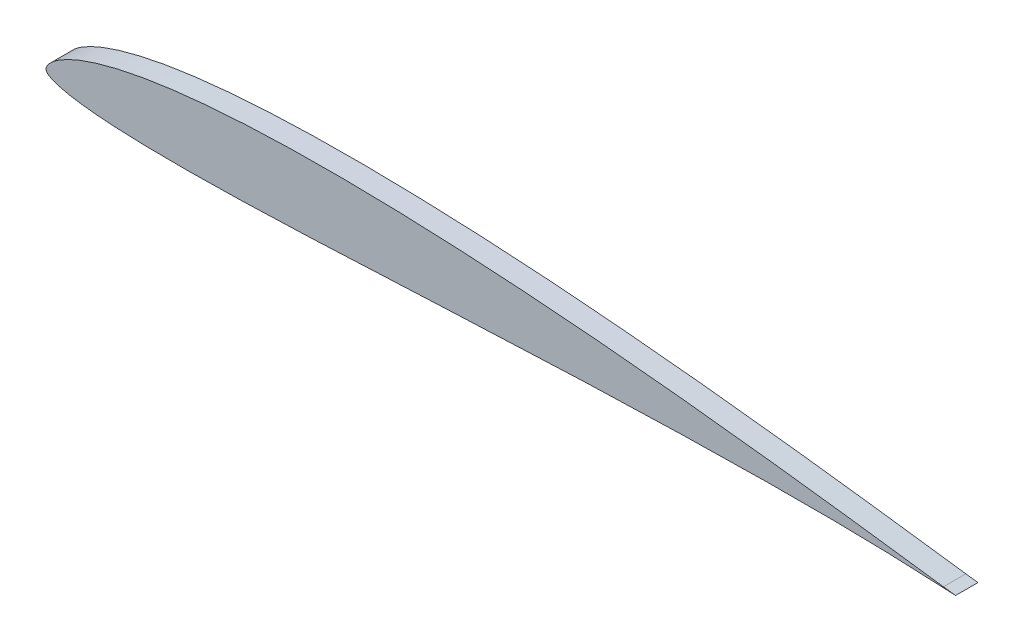
ISO-10303-21;
HEADER;
FILE_DESCRIPTION(('STEP AP214'),'2;1');
FILE_NAME('part.step','',(''),(''),'','','');
FILE_SCHEMA(('AUTOMOTIVE_DESIGN { 1 0 10303 214 1 1 1 1 }'));
ENDSEC;
DATA;
#1=APPLICATION_CONTEXT('core data for automotive mechanical design processes');
#2=APPLICATION_PROTOCOL_DEFINITION('international standard','automotive_design',2000,#1);
#3=PRODUCT_CONTEXT('',#1,'mechanical');
#4=PRODUCT('Part','Part','',(#3));
#5=PRODUCT_RELATED_PRODUCT_CATEGORY('part','',(#4));
#6=PRODUCT_DEFINITION_FORMATION('','',#4);
#7=PRODUCT_DEFINITION_CONTEXT('part definition',#1,'design');
#8=PRODUCT_DEFINITION('design','',#6,#7);
#9=PRODUCT_DEFINITION_SHAPE('','',#8);
#10=(LENGTH_UNIT() NAMED_UNIT(*) SI_UNIT(.MILLI.,.METRE.));
#11=(NAMED_UNIT(*) PLANE_ANGLE_UNIT() SI_UNIT($,.RADIAN.));
#12=(NAMED_UNIT(*) SI_UNIT($,.STERADIAN.) SOLID_ANGLE_UNIT());
#13=UNCERTAINTY_MEASURE_WITH_UNIT(LENGTH_MEASURE(1.E-05),#10,'distance_accuracy_value','');
#14=(GEOMETRIC_REPRESENTATION_CONTEXT(3) GLOBAL_UNCERTAINTY_ASSIGNED_CONTEXT((#13)) GLOBAL_UNIT_ASSIGNED_CONTEXT((#10,
#11,#12)) REPRESENTATION_CONTEXT('',''));
#15=CARTESIAN_POINT('',(0.,0.,0.));
#16=DIRECTION('',(0.,0.,1.));
#17=DIRECTION('',(1.,0.,0.));
#18=AXIS2_PLACEMENT_3D('',#15,#16,#17);
#19=CARTESIAN_POINT('',(203.2,-0.100617268431985,5.08));
#20=DIRECTION('',(0.121749636772563,0.992560842440275,0.));
#21=DIRECTION('',(-0.992560842440275,0.121749636772563,0.));
#22=AXIS2_PLACEMENT_3D('',#19,#20,#21);
#23=PLANE('',#22);
#24=DIRECTION('',(0.992560842440275,-0.121749636772563,0.));
#25=VECTOR('',#24,1.);
#26=CARTESIAN_POINT('',(203.2,-0.100617268431985,0.));
#27=LINE('',#26,#25);
#28=CARTESIAN_POINT('',(203.2,-0.100617268431985,0.));
#29=VERTEX_POINT('',#28);
#30=CARTESIAN_POINT('',(205.950245435933,-0.437968258459964,0.));
#31=VERTEX_POINT('',#30);
#32=EDGE_CURVE('E110',#29,#31,#27,.T.);
#33=ORIENTED_EDGE('',*,*,#32,.F.);
#34=DIRECTION('',(0.,0.,-1.));
#35=VECTOR('',#34,1.);
#36=CARTESIAN_POINT('',(203.2,-0.100617268431985,5.08));
#37=LINE('',#36,#35);
#38=CARTESIAN_POINT('',(203.2,-0.100617268431985,5.08));
#39=VERTEX_POINT('',#38);
#40=EDGE_CURVE('E12',#39,#29,#37,.T.);
#41=ORIENTED_EDGE('',*,*,#40,.F.);
#42=DIRECTION('',(0.992560842440275,-0.121749636772563,0.));
#43=VECTOR('',#42,1.);
#44=CARTESIAN_POINT('',(203.2,-0.100617268431985,5.08));
#45=LINE('',#44,#43);
#46=CARTESIAN_POINT('',(205.950245435933,-0.437968258459964,5.08));
#47=VERTEX_POINT('',#46);
#48=EDGE_CURVE('E97',#39,#47,#45,.T.);
#49=ORIENTED_EDGE('',*,*,#48,.T.);
#50=DIRECTION('',(0.,0.,-1.));
#51=VECTOR('',#50,1.);
#52=CARTESIAN_POINT('',(205.950245435933,-0.437968258459964,5.08));
#53=LINE('',#52,#51);
#54=EDGE_CURVE('E53',#47,#31,#53,.T.);
#55=ORIENTED_EDGE('',*,*,#54,.T.);
#56=EDGE_LOOP('',(#33,#41,#49,#55));
#57=FACE_BOUND('',#56,.T.);
#58=ADVANCED_FACE('F50',(#57),#23,.T.);
#59=CARTESIAN_POINT('',(203.2,-0.100617268431985,5.08));
#60=CARTESIAN_POINT('',(202.79720381662,-0.0512094266927017,5.08));
#61=CARTESIAN_POINT('',(201.580451916311,0.0980399649523381,5.08));
#62=CARTESIAN_POINT('',(199.447976907084,0.38451258538858,5.08));
#63=CARTESIAN_POINT('',(196.77975352602,0.739681963357594,5.08));
#64=CARTESIAN_POINT('',(193.985109848868,1.11895027312733,5.08));
#65=CARTESIAN_POINT('',(191.167417319945,1.49849757920047,5.08));
#66=CARTESIAN_POINT('',(188.346823798527,1.87616372226673,5.08));
#67=CARTESIAN_POINT('',(185.525409830636,2.24832243215014,5.08));
#68=CARTESIAN_POINT('',(182.703701905195,2.61673136002112,5.08));
#69=CARTESIAN_POINT('',(179.881561947793,2.97988541238249,5.08));
#70=CARTESIAN_POINT('',(177.059611950278,3.33878805501201,5.08));
#71=CARTESIAN_POINT('',(174.237524109839,3.69279564658321,5.08));
#72=CARTESIAN_POINT('',(170.475518901404,4.15997719687129,5.08));
#73=CARTESIAN_POINT('',(166.712715756317,4.61814924928133,5.08));
#74=CARTESIAN_POINT('',(162.949590213769,5.06673403109628,5.08));
#75=CARTESIAN_POINT('',(160.127061411144,5.39842344580611,5.08));
#76=CARTESIAN_POINT('',(157.304169872805,5.72410874023895,5.08));
#77=CARTESIAN_POINT('',(154.480835019842,6.04516962667473,5.08));
#78=CARTESIAN_POINT('',(151.656904615995,6.36014932324074,5.08));
#79=CARTESIAN_POINT('',(148.832344040144,6.6691102541897,5.08));
#80=CARTESIAN_POINT('',(146.007360314413,6.97258671041729,5.08));
#81=CARTESIAN_POINT('',(143.182003447861,7.26965220951078,5.08));
#82=CARTESIAN_POINT('',(140.356401756629,7.56054211895568,5.08));
#83=CARTESIAN_POINT('',(137.530435232801,7.84454614479991,5.08));
#84=CARTESIAN_POINT('',(134.704500587303,8.12183903814579,5.08));
#85=CARTESIAN_POINT('',(131.878411459751,8.39157565062392,5.08));
#86=CARTESIAN_POINT('',(129.052105194243,8.65344802495918,5.08));
#87=CARTESIAN_POINT('',(126.225681336403,8.90753779422576,5.08));
#88=CARTESIAN_POINT('',(123.399293267781,9.15314243325294,5.08));
#89=CARTESIAN_POINT('',(120.572870301902,9.39080691789401,5.08));
#90=CARTESIAN_POINT('',(116.804935383238,9.69600830861639,5.08));
#91=CARTESIAN_POINT('',(113.036553757512,9.98407047718813,5.08));
#92=CARTESIAN_POINT('',(109.267987351327,10.2536282535774,5.08));
#93=CARTESIAN_POINT('',(105.50092830803,10.5108698643073,5.08));
#94=CARTESIAN_POINT('',(101.73364578017,10.7479741965849,5.08));
#95=CARTESIAN_POINT('',(97.9665678603221,10.9655134985737,5.08));
#96=CARTESIAN_POINT('',(95.1421419252916,11.1176231220489,5.08));
#97=CARTESIAN_POINT('',(92.3183449944886,11.25922410986,5.08));
#98=CARTESIAN_POINT('',(89.4952129673963,11.389445435119,5.08));
#99=CARTESIAN_POINT('',(86.6727666862329,11.5082744209002,5.08));
#100=CARTESIAN_POINT('',(82.911487124979,11.6502242618459,5.08));
#101=CARTESIAN_POINT('',(78.2125634469429,11.7968808324985,5.08));
#102=CARTESIAN_POINT('',(73.5147067893036,11.8981108766664,5.08));
#103=CARTESIAN_POINT('',(69.7595282377999,11.9502790282577,5.08));
#104=CARTESIAN_POINT('',(66.9458517726665,11.9731637359591,5.08));
#105=CARTESIAN_POINT('',(64.1341344568586,11.9803154483272,5.08));
#106=CARTESIAN_POINT('',(61.3247831029279,11.969099991853,5.08));
#107=CARTESIAN_POINT('',(58.5181203928593,11.9410404923588,5.08));
#108=CARTESIAN_POINT('',(55.7143676434784,11.8926418307605,5.08));
#109=CARTESIAN_POINT('',(52.9139103469552,11.8241257532925,5.08));
#110=CARTESIAN_POINT('',(49.1872079763454,11.7033830445865,5.08));
#111=CARTESIAN_POINT('',(45.4677328358925,11.5360884720753,5.08));
#112=CARTESIAN_POINT('',(41.7570394075228,11.315286824748,5.08));
#113=CARTESIAN_POINT('',(38.9834482911353,11.1213393320245,5.08));
#114=CARTESIAN_POINT('',(36.218778961995,10.8961714179921,5.08));
#115=CARTESIAN_POINT('',(33.4643126195192,10.6383636978604,5.08));
#116=CARTESIAN_POINT('',(30.7227013236439,10.3430124575744,5.08));
#117=CARTESIAN_POINT('',(27.9961130453882,10.0095671145272,5.08));
#118=CARTESIAN_POINT('',(25.2877944049303,9.63219084756092,5.08));
#119=CARTESIAN_POINT('',(22.6025219853498,9.20739084675282,5.08));
#120=CARTESIAN_POINT('',(19.94483386804,8.72997632176014,5.08));
#121=CARTESIAN_POINT('',(17.3237406783105,8.19362692023427,5.08));
#122=CARTESIAN_POINT('',(14.7477752434259,7.59200620912939,5.08));
#123=CARTESIAN_POINT('',(12.2328314751348,6.91805026154764,5.08));
#124=CARTESIAN_POINT('',(9.80222557833202,6.16435151299876,5.08));
#125=CARTESIAN_POINT('',(7.5013093000574,5.33006385041904,5.08));
#126=CARTESIAN_POINT('',(5.41517133141638,4.43063906254846,5.08));
#127=CARTESIAN_POINT('',(3.66455855511836,3.51646707011307,5.08));
#128=CARTESIAN_POINT('',(2.33735513027934,2.66481601115,5.08));
#129=CARTESIAN_POINT('',(1.42509623429453,1.93915994002003,5.08));
#130=CARTESIAN_POINT('',(0.827981050452847,1.35542237765438,5.08));
#131=CARTESIAN_POINT('',(0.441274327893939,0.880143342873901,5.08));
#132=CARTESIAN_POINT('',(0.19079349595964,0.48090792978633,5.08));
#133=CARTESIAN_POINT('',(0.0404889301550585,0.131446638754077,5.08));
#134=CARTESIAN_POINT('',(-0.0140285352096761,-0.198072904687709,5.08));
#135=CARTESIAN_POINT('',(0.0557841610055205,-0.52264674411364,5.08));
#136=CARTESIAN_POINT('',(0.267897199811082,-0.825744248183187,5.08));
#137=CARTESIAN_POINT('',(0.614779540851643,-1.10917598584658,5.08));
#138=CARTESIAN_POINT('',(1.11880231935604,-1.40291417774954,5.08));
#139=CARTESIAN_POINT('',(1.8617979874032,-1.72658419889645,5.08));
#140=CARTESIAN_POINT('',(2.97005159285745,-2.09381812805213,5.08));
#141=CARTESIAN_POINT('',(4.54337389070912,-2.48316923193071,5.08));
#142=CARTESIAN_POINT('',(6.56825222861549,-2.85713013148444,5.08));
#143=CARTESIAN_POINT('',(8.92223028313623,-3.1759790611986,5.08));
#144=CARTESIAN_POINT('',(11.4590923531043,-3.43624640908878,5.08));
#145=CARTESIAN_POINT('',(14.0888477513325,-3.63824385792425,5.08));
#146=CARTESIAN_POINT('',(16.7692515001657,-3.79053384814901,5.08));
#147=CARTESIAN_POINT('',(19.4819886386148,-3.90267995838003,5.08));
#148=CARTESIAN_POINT('',(22.2173248165483,-3.98108167099376,5.08));
#149=CARTESIAN_POINT('',(24.9688695232444,-4.03216683084729,5.08));
#150=CARTESIAN_POINT('',(27.733036207471,-4.05850158243161,5.08));
#151=CARTESIAN_POINT('',(30.5067787455716,-4.06389493618947,5.08));
#152=CARTESIAN_POINT('',(33.2885628680928,-4.05114134413537,5.08));
#153=CARTESIAN_POINT('',(36.0766256871765,-4.0210375418487,5.08));
#154=CARTESIAN_POINT('',(38.8700221898337,-3.97616253824433,5.08));
#155=CARTESIAN_POINT('',(41.6677542855026,-3.91874383892961,5.08));
#156=CARTESIAN_POINT('',(44.4693361789958,-3.84942363611167,5.08));
#157=CARTESIAN_POINT('',(47.2741644061469,-3.76961386296504,5.08));
#158=CARTESIAN_POINT('',(50.0820296777703,-3.68031157345442,5.08));
#159=CARTESIAN_POINT('',(52.8925506840059,-3.5832183051563,5.08));
#160=CARTESIAN_POINT('',(55.7058179995031,-3.47820123590557,5.08));
#161=CARTESIAN_POINT('',(58.5217362187417,-3.36746625551428,5.08));
#162=CARTESIAN_POINT('',(61.3403840649227,-3.2521181612854,5.08));
#163=CARTESIAN_POINT('',(64.1616519777605,-3.13181482840604,5.08));
#164=CARTESIAN_POINT('',(66.9855748846382,-3.00785734019767,5.08));
#165=CARTESIAN_POINT('',(69.812118227041,-2.88020209229964,5.08));
#166=CARTESIAN_POINT('',(72.6413969315292,-2.75042984375857,5.08));
#167=CARTESIAN_POINT('',(75.4731584291989,-2.61813219833004,5.08));
#168=CARTESIAN_POINT('',(79.2529960165431,-2.44007567766431,5.08));
#169=CARTESIAN_POINT('',(83.0338042932632,-2.26004958539922,5.08));
#170=CARTESIAN_POINT('',(86.8138654439023,-2.07964592480024,5.08));
#171=CARTESIAN_POINT('',(89.6461959911765,-1.94523234448069,5.08));
#172=CARTESIAN_POINT('',(92.4765265757898,-1.81100712196067,5.08));
#173=CARTESIAN_POINT('',(95.304993022605,-1.67881476977027,5.08));
#174=CARTESIAN_POINT('',(98.1316211466072,-1.54824126738652,5.08));
#175=CARTESIAN_POINT('',(100.956506331875,-1.41996075311568,5.08));
#176=CARTESIAN_POINT('',(103.780336268643,-1.2930326243581,5.08));
#177=CARTESIAN_POINT('',(106.60332189158,-1.16940870375824,5.08));
#178=CARTESIAN_POINT('',(109.42541965539,-1.04846442880387,5.08));
#179=CARTESIAN_POINT('',(112.246433737902,-0.9304319450935,5.08));
#180=CARTESIAN_POINT('',(115.066818041738,-0.815131894215961,5.08));
#181=CARTESIAN_POINT('',(117.886361110804,-0.704261200235161,5.08));
#182=CARTESIAN_POINT('',(120.705124684984,-0.596293965319624,5.08));
#183=CARTESIAN_POINT('',(123.522827525326,-0.492777088233758,5.08));
#184=CARTESIAN_POINT('',(126.339771365018,-0.393065039573002,5.08));
#185=CARTESIAN_POINT('',(130.093763619375,-0.266371516886291,5.08));
#186=CARTESIAN_POINT('',(133.846963358215,-0.148319066941068,5.08));
#187=CARTESIAN_POINT('',(137.59959570311,-0.040354383188542,5.08));
#188=CARTESIAN_POINT('',(140.413697463867,0.0362246680191013,5.08));
#189=CARTESIAN_POINT('',(143.22781575284,0.107363689882669,5.08));
#190=CARTESIAN_POINT('',(146.980533751766,0.196449437297716,5.08));
#191=CARTESIAN_POINT('',(150.733888428254,0.274956546231044,5.08));
#192=CARTESIAN_POINT('',(154.487963163436,0.343763847675414,5.08));
#193=CARTESIAN_POINT('',(157.304049111824,0.388107893920395,5.08));
#194=CARTESIAN_POINT('',(160.120792660306,0.427324225694775,5.08));
#195=CARTESIAN_POINT('',(162.938428455789,0.459012795806288,5.08));
#196=CARTESIAN_POINT('',(165.756944662893,0.483220321093811,5.08));
#197=CARTESIAN_POINT('',(168.576075909088,0.498535298272943,5.08));
#198=CARTESIAN_POINT('',(171.395749827843,0.505727248888174,5.08));
#199=CARTESIAN_POINT('',(174.215970767451,0.501872707438048,5.08));
#200=CARTESIAN_POINT('',(177.036738589688,0.488150248349388,5.08));
#201=CARTESIAN_POINT('',(179.857921635086,0.462760491305361,5.08));
#202=CARTESIAN_POINT('',(182.679519704925,0.424417506826524,5.08));
#203=CARTESIAN_POINT('',(185.501374927109,0.371545664049802,5.08));
#204=CARTESIAN_POINT('',(188.323332205707,0.305598234434296,5.08));
#205=CARTESIAN_POINT('',(191.145402373552,0.22358601869094,5.08));
#206=CARTESIAN_POINT('',(193.965637727377,0.126297599844218,5.08));
#207=CARTESIAN_POINT('',(196.767087138439,0.0145845398118625,5.08));
#208=CARTESIAN_POINT('',(199.441721084474,-0.10433682633005,5.08));
#209=CARTESIAN_POINT('',(201.580203970441,-0.212851992987618,5.08));
#210=CARTESIAN_POINT('',(202.796999817628,-0.275533443295145,5.08));
#211=CARTESIAN_POINT('',(203.2,-0.296293405587617,5.08));
#212=B_SPLINE_CURVE_WITH_KNOTS('',3,(#59,#60,#61,#62,#63,#64,#65,#66,#67,#68,#69,#70,#71,#72,
#73,#74,#75,#76,#77,#78,#79,#80,#81,#82,#83,#84,#85,#86,#87,#88,#89,#90,#91,#92,#93,#94,#95,#96,
#97,#98,#99,#100,#101,#102,#103,#104,#105,#106,#107,#108,#109,#110,#111,#112,#113,#114,#115,
#116,#117,#118,#119,#120,#121,#122,#123,#124,#125,#126,#127,#128,#129,#130,#131,#132,#133,#134,
#135,#136,#137,#138,#139,#140,#141,#142,#143,#144,#145,#146,#147,#148,#149,#150,#151,#152,#153,
#154,#155,#156,#157,#158,#159,#160,#161,#162,#163,#164,#165,#166,#167,#168,#169,#170,#171,#172,
#173,#174,#175,#176,#177,#178,#179,#180,#181,#182,#183,#184,#185,#186,#187,#188,#189,#190,#191,
#192,#193,#194,#195,#196,#197,#198,#199,#200,#201,#202,#203,#204,#205,#206,#207,#208,#209,#210,
#211),.UNSPECIFIED.,.F.,.F.,(4,1,1,1,1,1,1,1,1,1,1,1,1,1,1,1,1,1,1,1,1,1,1,1,1,1,1,1,1,1,1,1,1,
1,1,1,1,1,1,1,1,1,1,1,1,1,1,1,1,1,1,1,1,1,1,1,1,1,1,1,1,1,1,1,1,1,1,1,1,1,1,1,1,1,1,1,1,1,1,1,1,
1,1,1,1,1,1,1,1,1,1,1,1,1,1,1,1,1,1,1,1,1,1,1,1,1,1,1,1,1,1,1,1,1,1,1,1,1,1,1,1,1,1,1,1,1,1,1,1,
1,1,1,1,1,1,1,1,1,1,1,1,1,1,1,1,1,1,1,1,1,4),(0.,0.00296411665271611,0.0089538945966763,
0.0157155553741986,0.022625190175558,0.0295534555378367,0.0364822705336194,0.0434110582244961,
0.0503399655545711,0.0572673467736388,0.0641943281808356,0.0711179201706099,0.0780418206164881,
0.091883617901493,0.098804928653391,0.105722820958378,0.112641625273765,0.119560496658562,
0.126477762921577,0.133395912374017,0.140314536437145,0.14723055601991,0.154146464906324,
0.161062198401924,0.167975777635694,0.174886609289169,0.181798143490229,0.188707924225706,
0.195614440613466,0.202520257363211,0.209425351294229,0.223226072570092,0.230125213713481,
0.237021781364082,0.250805240631273,0.25769625166669,0.264582838722126,0.271465100128855,
0.278347536463628,0.285225271167883,0.29209885669581,0.305839934287044,0.319563209426406,
0.326420187883577,0.333270806703105,0.340115280251541,0.346957312883094,0.353790744437203,
0.360616425322828,0.367439194379685,0.37425161878993,0.387850773907908,0.394633044804391,
0.401402551965937,0.408158543233929,0.414892998053965,0.42160892343845,0.428298863183098,
0.43495597113572,0.441580950447059,0.448155138601882,0.454677179732133,0.461120350253386,
0.467473869945867,0.473690892845259,0.47970221097704,0.485342583587277,0.490271889644776,
0.494111129920548,0.496842211489221,0.498771831369562,0.500198867652721,0.501307654952534,
0.502204472441875,0.502962609813949,0.503708984077282,0.504565750926071,0.505610251628692,
0.506960116907385,0.508815615682967,0.511519486293983,0.51547838259087,0.520644271209619,
0.526552427913912,0.532824473873153,0.539268843888887,0.545815426921883,0.552433143389216,
0.559099351334899,0.565802503912892,0.572533988645433,0.579289903039673,0.586062197427898,
0.592852616441672,0.599655387399752,0.60646812382644,0.613291894201643,0.620124754014497,
0.626963242299182,0.63381128586732,0.640665424121318,0.647526042737776,0.654395046265754,
0.661270455949904,0.668151708455317,0.675041242410986,0.681936976601868,0.688838892603522,
0.695747395053285,0.709576069821284,0.716485747925019,0.723388931395268,0.730287102934606,
0.737182123472742,0.744071007137293,0.750955216594622,0.757836754148853,0.764717490730159,
0.771594467651412,0.778468680155238,0.785340609132731,0.792212161518035,0.799078938597568,
0.805944356214518,0.812806945270248,0.819667180733528,0.833379655024659,0.840234372635546,
0.847088277479736,0.85394185780806,0.860795653863032,0.874506380169985,0.881362851603148,
0.888220537429042,0.895078010559448,0.901938729776825,0.908802231487597,0.915665587920595,
0.922530344940029,0.929397561921198,0.936264857969405,0.943133836181653,0.95000465870612,
0.956876033001204,0.963748611505872,0.97062217782377,0.977497431873452,0.984360164529191,
0.991100560263919,0.997052524591586,1.),.UNSPECIFIED.);
#213=DIRECTION('',(0.,0.,-1.));
#214=VECTOR('',#213,1.);
#215=SURFACE_OF_LINEAR_EXTRUSION('',#212,#214);
#216=CARTESIAN_POINT('',(203.2,-0.100617268431985,0.));
#217=CARTESIAN_POINT('',(202.79720381662,-0.0512094266927017,0.));
#218=CARTESIAN_POINT('',(201.580451916311,0.0980399649523381,0.));
#219=CARTESIAN_POINT('',(199.447976907084,0.38451258538858,0.));
#220=CARTESIAN_POINT('',(196.77975352602,0.739681963357594,0.));
#221=CARTESIAN_POINT('',(193.985109848868,1.11895027312733,0.));
#222=CARTESIAN_POINT('',(191.167417319945,1.49849757920047,0.));
#223=CARTESIAN_POINT('',(188.346823798527,1.87616372226673,0.));
#224=CARTESIAN_POINT('',(185.525409830636,2.24832243215014,0.));
#225=CARTESIAN_POINT('',(182.703701905195,2.61673136002112,0.));
#226=CARTESIAN_POINT('',(179.881561947793,2.97988541238249,0.));
#227=CARTESIAN_POINT('',(177.059611950278,3.33878805501201,0.));
#228=CARTESIAN_POINT('',(174.237524109839,3.69279564658321,0.));
#229=CARTESIAN_POINT('',(170.475518901404,4.15997719687129,0.));
#230=CARTESIAN_POINT('',(166.712715756317,4.61814924928133,0.));
#231=CARTESIAN_POINT('',(162.949590213769,5.06673403109628,0.));
#232=CARTESIAN_POINT('',(160.127061411144,5.39842344580611,0.));
#233=CARTESIAN_POINT('',(157.304169872805,5.72410874023895,0.));
#234=CARTESIAN_POINT('',(154.480835019842,6.04516962667473,0.));
#235=CARTESIAN_POINT('',(151.656904615995,6.36014932324074,0.));
#236=CARTESIAN_POINT('',(148.832344040144,6.6691102541897,0.));
#237=CARTESIAN_POINT('',(146.007360314413,6.97258671041729,0.));
#238=CARTESIAN_POINT('',(143.182003447861,7.26965220951078,0.));
#239=CARTESIAN_POINT('',(140.356401756629,7.56054211895568,0.));
#240=CARTESIAN_POINT('',(137.530435232801,7.84454614479991,0.));
#241=CARTESIAN_POINT('',(134.704500587303,8.12183903814579,0.));
#242=CARTESIAN_POINT('',(131.878411459751,8.39157565062392,0.));
#243=CARTESIAN_POINT('',(129.052105194243,8.65344802495918,0.));
#244=CARTESIAN_POINT('',(126.225681336403,8.90753779422576,0.));
#245=CARTESIAN_POINT('',(123.399293267781,9.15314243325294,0.));
#246=CARTESIAN_POINT('',(120.572870301902,9.39080691789401,0.));
#247=CARTESIAN_POINT('',(116.804935383238,9.69600830861639,0.));
#248=CARTESIAN_POINT('',(113.036553757512,9.98407047718813,0.));
#249=CARTESIAN_POINT('',(109.267987351327,10.2536282535774,0.));
#250=CARTESIAN_POINT('',(105.50092830803,10.5108698643073,0.));
#251=CARTESIAN_POINT('',(101.73364578017,10.7479741965849,0.));
#252=CARTESIAN_POINT('',(97.9665678603221,10.9655134985737,0.));
#253=CARTESIAN_POINT('',(95.1421419252916,11.1176231220489,0.));
#254=CARTESIAN_POINT('',(92.3183449944886,11.25922410986,0.));
#255=CARTESIAN_POINT('',(89.4952129673963,11.389445435119,0.));
#256=CARTESIAN_POINT('',(86.6727666862329,11.5082744209002,0.));
#257=CARTESIAN_POINT('',(82.911487124979,11.6502242618459,0.));
#258=CARTESIAN_POINT('',(78.2125634469429,11.7968808324985,0.));
#259=CARTESIAN_POINT('',(73.5147067893036,11.8981108766664,0.));
#260=CARTESIAN_POINT('',(69.7595282377999,11.9502790282577,0.));
#261=CARTESIAN_POINT('',(66.9458517726665,11.9731637359591,0.));
#262=CARTESIAN_POINT('',(64.1341344568586,11.9803154483272,0.));
#263=CARTESIAN_POINT('',(61.3247831029279,11.969099991853,0.));
#264=CARTESIAN_POINT('',(58.5181203928593,11.9410404923588,0.));
#265=CARTESIAN_POINT('',(55.7143676434784,11.8926418307605,0.));
#266=CARTESIAN_POINT('',(52.9139103469552,11.8241257532925,0.));
#267=CARTESIAN_POINT('',(49.1872079763454,11.7033830445865,0.));
#268=CARTESIAN_POINT('',(45.4677328358925,11.5360884720753,0.));
#269=CARTESIAN_POINT('',(41.7570394075228,11.315286824748,0.));
#270=CARTESIAN_POINT('',(38.9834482911353,11.1213393320245,0.));
#271=CARTESIAN_POINT('',(36.218778961995,10.8961714179921,0.));
#272=CARTESIAN_POINT('',(33.4643126195192,10.6383636978604,0.));
#273=CARTESIAN_POINT('',(30.7227013236439,10.3430124575744,0.));
#274=CARTESIAN_POINT('',(27.9961130453882,10.0095671145272,0.));
#275=CARTESIAN_POINT('',(25.2877944049303,9.63219084756092,0.));
#276=CARTESIAN_POINT('',(22.6025219853498,9.20739084675282,0.));
#277=CARTESIAN_POINT('',(19.94483386804,8.72997632176014,0.));
#278=CARTESIAN_POINT('',(17.3237406783105,8.19362692023427,0.));
#279=CARTESIAN_POINT('',(14.7477752434259,7.59200620912939,0.));
#280=CARTESIAN_POINT('',(12.2328314751348,6.91805026154764,0.));
#281=CARTESIAN_POINT('',(9.80222557833202,6.16435151299876,0.));
#282=CARTESIAN_POINT('',(7.5013093000574,5.33006385041904,0.));
#283=CARTESIAN_POINT('',(5.41517133141638,4.43063906254846,0.));
#284=CARTESIAN_POINT('',(3.66455855511836,3.51646707011307,0.));
#285=CARTESIAN_POINT('',(2.33735513027934,2.66481601115,0.));
#286=CARTESIAN_POINT('',(1.42509623429453,1.93915994002003,0.));
#287=CARTESIAN_POINT('',(0.827981050452847,1.35542237765438,0.));
#288=CARTESIAN_POINT('',(0.441274327893939,0.880143342873901,0.));
#289=CARTESIAN_POINT('',(0.19079349595964,0.48090792978633,0.));
#290=CARTESIAN_POINT('',(0.0404889301550585,0.131446638754077,0.));
#291=CARTESIAN_POINT('',(-0.0140285352096761,-0.198072904687709,0.));
#292=CARTESIAN_POINT('',(0.0557841610055205,-0.52264674411364,0.));
#293=CARTESIAN_POINT('',(0.267897199811082,-0.825744248183187,0.));
#294=CARTESIAN_POINT('',(0.614779540851643,-1.10917598584658,0.));
#295=CARTESIAN_POINT('',(1.11880231935604,-1.40291417774954,0.));
#296=CARTESIAN_POINT('',(1.8617979874032,-1.72658419889645,0.));
#297=CARTESIAN_POINT('',(2.97005159285745,-2.09381812805213,0.));
#298=CARTESIAN_POINT('',(4.54337389070912,-2.48316923193071,0.));
#299=CARTESIAN_POINT('',(6.56825222861549,-2.85713013148444,0.));
#300=CARTESIAN_POINT('',(8.92223028313623,-3.1759790611986,0.));
#301=CARTESIAN_POINT('',(11.4590923531043,-3.43624640908878,0.));
#302=CARTESIAN_POINT('',(14.0888477513325,-3.63824385792425,0.));
#303=CARTESIAN_POINT('',(16.7692515001657,-3.79053384814901,0.));
#304=CARTESIAN_POINT('',(19.4819886386148,-3.90267995838003,0.));
#305=CARTESIAN_POINT('',(22.2173248165483,-3.98108167099376,0.));
#306=CARTESIAN_POINT('',(24.9688695232444,-4.03216683084729,0.));
#307=CARTESIAN_POINT('',(27.733036207471,-4.05850158243161,0.));
#308=CARTESIAN_POINT('',(30.5067787455716,-4.06389493618947,0.));
#309=CARTESIAN_POINT('',(33.2885628680928,-4.05114134413537,0.));
#310=CARTESIAN_POINT('',(36.0766256871765,-4.0210375418487,0.));
#311=CARTESIAN_POINT('',(38.8700221898337,-3.97616253824433,0.));
#312=CARTESIAN_POINT('',(41.6677542855026,-3.91874383892961,0.));
#313=CARTESIAN_POINT('',(44.4693361789958,-3.84942363611167,0.));
#314=CARTESIAN_POINT('',(47.2741644061469,-3.76961386296504,0.));
#315=CARTESIAN_POINT('',(50.0820296777703,-3.68031157345442,0.));
#316=CARTESIAN_POINT('',(52.8925506840059,-3.5832183051563,0.));
#317=CARTESIAN_POINT('',(55.7058179995031,-3.47820123590557,0.));
#318=CARTESIAN_POINT('',(58.5217362187417,-3.36746625551428,0.));
#319=CARTESIAN_POINT('',(61.3403840649227,-3.2521181612854,0.));
#320=CARTESIAN_POINT('',(64.1616519777605,-3.13181482840604,0.));
#321=CARTESIAN_POINT('',(66.9855748846382,-3.00785734019767,0.));
#322=CARTESIAN_POINT('',(69.812118227041,-2.88020209229964,0.));
#323=CARTESIAN_POINT('',(72.6413969315292,-2.75042984375857,0.));
#324=CARTESIAN_POINT('',(75.4731584291989,-2.61813219833004,0.));
#325=CARTESIAN_POINT('',(79.2529960165431,-2.44007567766431,0.));
#326=CARTESIAN_POINT('',(83.0338042932632,-2.26004958539922,0.));
#327=CARTESIAN_POINT('',(86.8138654439023,-2.07964592480024,0.));
#328=CARTESIAN_POINT('',(89.6461959911765,-1.94523234448069,0.));
#329=CARTESIAN_POINT('',(92.4765265757898,-1.81100712196067,0.));
#330=CARTESIAN_POINT('',(95.304993022605,-1.67881476977027,0.));
#331=CARTESIAN_POINT('',(98.1316211466072,-1.54824126738652,0.));
#332=CARTESIAN_POINT('',(100.956506331875,-1.41996075311568,0.));
#333=CARTESIAN_POINT('',(103.780336268643,-1.2930326243581,0.));
#334=CARTESIAN_POINT('',(106.60332189158,-1.16940870375824,0.));
#335=CARTESIAN_POINT('',(109.42541965539,-1.04846442880387,0.));
#336=CARTESIAN_POINT('',(112.246433737902,-0.9304319450935,0.));
#337=CARTESIAN_POINT('',(115.066818041738,-0.815131894215961,0.));
#338=CARTESIAN_POINT('',(117.886361110804,-0.704261200235161,0.));
#339=CARTESIAN_POINT('',(120.705124684984,-0.596293965319624,0.));
#340=CARTESIAN_POINT('',(123.522827525326,-0.492777088233758,0.));
#341=CARTESIAN_POINT('',(126.339771365018,-0.393065039573002,0.));
#342=CARTESIAN_POINT('',(130.093763619375,-0.266371516886291,0.));
#343=CARTESIAN_POINT('',(133.846963358215,-0.148319066941068,0.));
#344=CARTESIAN_POINT('',(137.59959570311,-0.040354383188542,0.));
#345=CARTESIAN_POINT('',(140.413697463867,0.0362246680191013,0.));
#346=CARTESIAN_POINT('',(143.22781575284,0.107363689882669,0.));
#347=CARTESIAN_POINT('',(146.980533751766,0.196449437297716,0.));
#348=CARTESIAN_POINT('',(150.733888428254,0.274956546231044,0.));
#349=CARTESIAN_POINT('',(154.487963163436,0.343763847675414,0.));
#350=CARTESIAN_POINT('',(157.304049111824,0.388107893920395,0.));
#351=CARTESIAN_POINT('',(160.120792660306,0.427324225694775,0.));
#352=CARTESIAN_POINT('',(162.938428455789,0.459012795806288,0.));
#353=CARTESIAN_POINT('',(165.756944662893,0.483220321093811,0.));
#354=CARTESIAN_POINT('',(168.576075909088,0.498535298272943,0.));
#355=CARTESIAN_POINT('',(171.395749827843,0.505727248888174,0.));
#356=CARTESIAN_POINT('',(174.215970767451,0.501872707438048,0.));
#357=CARTESIAN_POINT('',(177.036738589688,0.488150248349388,0.));
#358=CARTESIAN_POINT('',(179.857921635086,0.462760491305361,0.));
#359=CARTESIAN_POINT('',(182.679519704925,0.424417506826524,0.));
#360=CARTESIAN_POINT('',(185.501374927109,0.371545664049802,0.));
#361=CARTESIAN_POINT('',(188.323332205707,0.305598234434296,0.));
#362=CARTESIAN_POINT('',(191.145402373552,0.22358601869094,0.));
#363=CARTESIAN_POINT('',(193.965637727377,0.126297599844218,0.));
#364=CARTESIAN_POINT('',(196.767087138439,0.0145845398118625,0.));
#365=CARTESIAN_POINT('',(199.441721084474,-0.10433682633005,0.));
#366=CARTESIAN_POINT('',(201.580203970441,-0.212851992987618,0.));
#367=CARTESIAN_POINT('',(202.796999817628,-0.275533443295145,0.));
#368=CARTESIAN_POINT('',(203.2,-0.296293405587617,0.));
#369=B_SPLINE_CURVE_WITH_KNOTS('',3,(#216,#217,#218,#219,#220,#221,#222,#223,#224,#225,#226,
#227,#228,#229,#230,#231,#232,#233,#234,#235,#236,#237,#238,#239,#240,#241,#242,#243,#244,#245,
#246,#247,#248,#249,#250,#251,#252,#253,#254,#255,#256,#257,#258,#259,#260,#261,#262,#263,#264,
#265,#266,#267,#268,#269,#270,#271,#272,#273,#274,#275,#276,#277,#278,#279,#280,#281,#282,#283,
#284,#285,#286,#287,#288,#289,#290,#291,#292,#293,#294,#295,#296,#297,#298,#299,#300,#301,#302,
#303,#304,#305,#306,#307,#308,#309,#310,#311,#312,#313,#314,#315,#316,#317,#318,#319,#320,#321,
#322,#323,#324,#325,#326,#327,#328,#329,#330,#331,#332,#333,#334,#335,#336,#337,#338,#339,#340,
#341,#342,#343,#344,#345,#346,#347,#348,#349,#350,#351,#352,#353,#354,#355,#356,#357,#358,#359,
#360,#361,#362,#363,#364,#365,#366,#367,#368),.UNSPECIFIED.,.F.,.F.,(4,1,1,1,1,1,1,1,1,1,1,1,1,
1,1,1,1,1,1,1,1,1,1,1,1,1,1,1,1,1,1,1,1,1,1,1,1,1,1,1,1,1,1,1,1,1,1,1,1,1,1,1,1,1,1,1,1,1,1,1,1,
1,1,1,1,1,1,1,1,1,1,1,1,1,1,1,1,1,1,1,1,1,1,1,1,1,1,1,1,1,1,1,1,1,1,1,1,1,1,1,1,1,1,1,1,1,1,1,1,
1,1,1,1,1,1,1,1,1,1,1,1,1,1,1,1,1,1,1,1,1,1,1,1,1,1,1,1,1,1,1,1,1,1,1,1,1,1,1,1,1,4),(0.,
0.00296411665271611,0.0089538945966763,0.0157155553741986,0.022625190175558,0.0295534555378367,
0.0364822705336194,0.0434110582244961,0.0503399655545711,0.0572673467736388,0.0641943281808356,
0.0711179201706099,0.0780418206164881,0.091883617901493,0.098804928653391,0.105722820958378,
0.112641625273765,0.119560496658562,0.126477762921577,0.133395912374017,0.140314536437145,
0.14723055601991,0.154146464906324,0.161062198401924,0.167975777635694,0.174886609289169,
0.181798143490229,0.188707924225706,0.195614440613466,0.202520257363211,0.209425351294229,
0.223226072570092,0.230125213713481,0.237021781364082,0.250805240631273,0.25769625166669,
0.264582838722126,0.271465100128855,0.278347536463628,0.285225271167883,0.29209885669581,
0.305839934287044,0.319563209426406,0.326420187883577,0.333270806703105,0.340115280251541,
0.346957312883094,0.353790744437203,0.360616425322828,0.367439194379685,0.37425161878993,
0.387850773907908,0.394633044804391,0.401402551965937,0.408158543233929,0.414892998053965,
0.42160892343845,0.428298863183098,0.43495597113572,0.441580950447059,0.448155138601882,
0.454677179732133,0.461120350253386,0.467473869945867,0.473690892845259,0.47970221097704,
0.485342583587277,0.490271889644776,0.494111129920548,0.496842211489221,0.498771831369562,
0.500198867652721,0.501307654952534,0.502204472441875,0.502962609813949,0.503708984077282,
0.504565750926071,0.505610251628692,0.506960116907385,0.508815615682967,0.511519486293983,
0.51547838259087,0.520644271209619,0.526552427913912,0.532824473873153,0.539268843888887,
0.545815426921883,0.552433143389216,0.559099351334899,0.565802503912892,0.572533988645433,
0.579289903039673,0.586062197427898,0.592852616441672,0.599655387399752,0.60646812382644,
0.613291894201643,0.620124754014497,0.626963242299182,0.63381128586732,0.640665424121318,
0.647526042737776,0.654395046265754,0.661270455949904,0.668151708455317,0.675041242410986,
0.681936976601868,0.688838892603522,0.695747395053285,0.709576069821284,0.716485747925019,
0.723388931395268,0.730287102934606,0.737182123472742,0.744071007137293,0.750955216594622,
0.757836754148853,0.764717490730159,0.771594467651412,0.778468680155238,0.785340609132731,
0.792212161518035,0.799078938597568,0.805944356214518,0.812806945270248,0.819667180733528,
0.833379655024659,0.840234372635546,0.847088277479736,0.85394185780806,0.860795653863032,
0.874506380169985,0.881362851603148,0.888220537429042,0.895078010559448,0.901938729776825,
0.908802231487597,0.915665587920595,0.922530344940029,0.929397561921198,0.936264857969405,
0.943133836181653,0.95000465870612,0.956876033001204,0.963748611505872,0.97062217782377,
0.977497431873452,0.984360164529191,0.991100560263919,0.997052524591586,1.),.UNSPECIFIED.);
#370=CARTESIAN_POINT('',(203.2,-0.296293405587617,0.));
#371=VERTEX_POINT('',#370);
#372=EDGE_CURVE('E101',#29,#371,#369,.T.);
#373=ORIENTED_EDGE('',*,*,#372,.T.);
#374=DIRECTION('',(0.,0.,-1.));
#375=VECTOR('',#374,1.);
#376=CARTESIAN_POINT('',(203.2,-0.296293405587617,5.08));
#377=LINE('',#376,#375);
#378=CARTESIAN_POINT('',(203.2,-0.296293405587617,5.08));
#379=VERTEX_POINT('',#378);
#380=EDGE_CURVE('E60',#379,#371,#377,.T.);
#381=ORIENTED_EDGE('',*,*,#380,.F.);
#382=EDGE_CURVE('E93',#39,#379,#212,.T.);
#383=ORIENTED_EDGE('',*,*,#382,.F.);
#384=ORIENTED_EDGE('',*,*,#40,.T.);
#385=EDGE_LOOP('',(#373,#381,#383,#384));
#386=FACE_BOUND('',#385,.T.);
#387=ADVANCED_FACE('F118',(#386),#215,.F.);
#388=CARTESIAN_POINT('',(205.950245435933,-0.437968258459964,5.08));
#389=DIRECTION('',(-0.0514453172127252,-0.998675812932746,0.));
#390=DIRECTION('',(0.998675812932747,-0.0514453172127252,0.));
#391=AXIS2_PLACEMENT_3D('',#388,#389,#390);
#392=PLANE('',#391);
#393=DIRECTION('',(-0.998675812932746,0.0514453172127252,0.));
#394=VECTOR('',#393,1.);
#395=CARTESIAN_POINT('',(205.950245435933,-0.437968258459964,0.));
#396=LINE('',#395,#394);
#397=EDGE_CURVE('E90',#31,#371,#396,.T.);
#398=ORIENTED_EDGE('',*,*,#397,.F.);
#399=ORIENTED_EDGE('',*,*,#54,.F.);
#400=DIRECTION('',(-0.998675812932746,0.0514453172127252,0.));
#401=VECTOR('',#400,1.);
#402=CARTESIAN_POINT('',(205.950245435933,-0.437968258459964,5.08));
#403=LINE('',#402,#401);
#404=EDGE_CURVE('E88',#47,#379,#403,.T.);
#405=ORIENTED_EDGE('',*,*,#404,.T.);
#406=ORIENTED_EDGE('',*,*,#380,.T.);
#407=EDGE_LOOP('',(#398,#399,#405,#406));
#408=FACE_BOUND('',#407,.T.);
#409=ADVANCED_FACE('F87',(#408),#392,.T.);
#410=CARTESIAN_POINT('',(0.472376124380114,0.904699381954133,5.08));
#411=DIRECTION('',(0.,0.,1.));
#412=DIRECTION('',(1.,0.,0.));
#413=AXIS2_PLACEMENT_3D('',#410,#411,#412);
#414=PLANE('',#413);
#415=ORIENTED_EDGE('',*,*,#48,.F.);
#416=ORIENTED_EDGE('',*,*,#382,.T.);
#417=ORIENTED_EDGE('',*,*,#404,.F.);
#418=EDGE_LOOP('',(#415,#416,#417));
#419=FACE_BOUND('',#418,.T.);
#420=ADVANCED_FACE('F96',(#419),#414,.T.);
#421=CARTESIAN_POINT('',(0.472376124380114,0.904699381954133,0.));
#422=DIRECTION('',(0.,0.,1.));
#423=DIRECTION('',(1.,0.,0.));
#424=AXIS2_PLACEMENT_3D('',#421,#422,#423);
#425=PLANE('',#424);
#426=ORIENTED_EDGE('',*,*,#32,.T.);
#427=ORIENTED_EDGE('',*,*,#397,.T.);
#428=ORIENTED_EDGE('',*,*,#372,.F.);
#429=EDGE_LOOP('',(#426,#427,#428));
#430=FACE_BOUND('',#429,.T.);
#431=ADVANCED_FACE('F121',(#430),#425,.F.);
#432=CLOSED_SHELL('',(#58,#387,#409,#420,#431));
#433=MANIFOLD_SOLID_BREP('B2',#432);
#434=ADVANCED_BREP_SHAPE_REPRESENTATION('',(#18,#433),#14);
#435=SHAPE_DEFINITION_REPRESENTATION(#9,#434);
ENDSEC;
END-ISO-10303-21;
